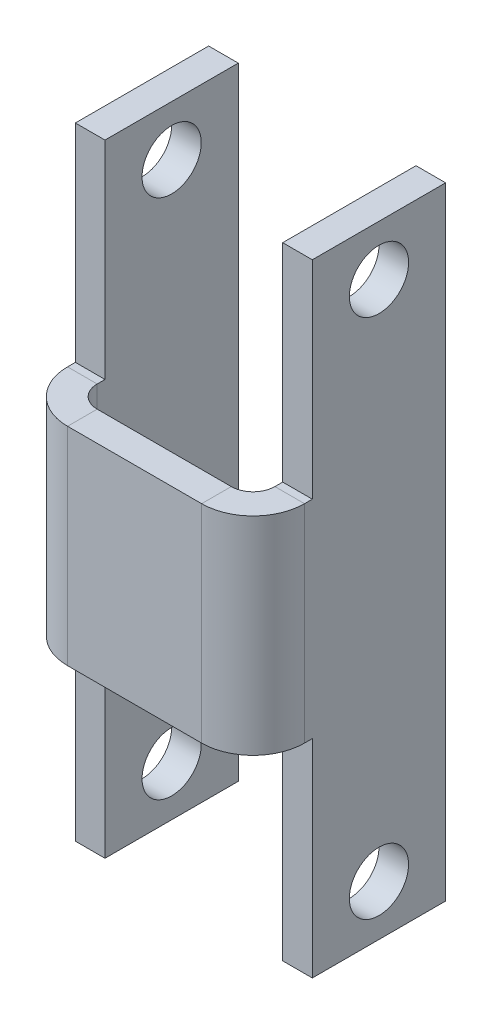
ISO-10303-21;
HEADER;
FILE_DESCRIPTION(('STEP AP214'),'2;1');
FILE_NAME('part.step','',(''),(''),'','','');
FILE_SCHEMA(('AUTOMOTIVE_DESIGN { 1 0 10303 214 1 1 1 1 }'));
ENDSEC;
DATA;
#1=APPLICATION_CONTEXT('core data for automotive mechanical design processes');
#2=APPLICATION_PROTOCOL_DEFINITION('international standard','automotive_design',2000,#1);
#3=PRODUCT_CONTEXT('',#1,'mechanical');
#4=PRODUCT('Part','Part','',(#3));
#5=PRODUCT_RELATED_PRODUCT_CATEGORY('part','',(#4));
#6=PRODUCT_DEFINITION_FORMATION('','',#4);
#7=PRODUCT_DEFINITION_CONTEXT('part definition',#1,'design');
#8=PRODUCT_DEFINITION('design','',#6,#7);
#9=PRODUCT_DEFINITION_SHAPE('','',#8);
#10=(LENGTH_UNIT() NAMED_UNIT(*) SI_UNIT(.MILLI.,.METRE.));
#11=(NAMED_UNIT(*) PLANE_ANGLE_UNIT() SI_UNIT($,.RADIAN.));
#12=(NAMED_UNIT(*) SI_UNIT($,.STERADIAN.) SOLID_ANGLE_UNIT());
#13=UNCERTAINTY_MEASURE_WITH_UNIT(LENGTH_MEASURE(1.E-05),#10,'distance_accuracy_value','');
#14=(GEOMETRIC_REPRESENTATION_CONTEXT(3) GLOBAL_UNCERTAINTY_ASSIGNED_CONTEXT((#13)) GLOBAL_UNIT_ASSIGNED_CONTEXT((#10,
#11,#12)) REPRESENTATION_CONTEXT('',''));
#15=CARTESIAN_POINT('',(0.,0.,0.));
#16=DIRECTION('',(0.,0.,1.));
#17=DIRECTION('',(1.,0.,0.));
#18=AXIS2_PLACEMENT_3D('',#15,#16,#17);
#19=CARTESIAN_POINT('',(-6.,-3.5,0.));
#20=DIRECTION('',(0.,1.,0.));
#21=DIRECTION('',(0.,0.,1.));
#22=AXIS2_PLACEMENT_3D('',#19,#20,#21);
#23=PLANE('',#22);
#24=DIRECTION('',(0.,0.,1.));
#25=VECTOR('',#24,1.);
#26=CARTESIAN_POINT('',(4.,-3.5,0.));
#27=LINE('',#26,#25);
#28=CARTESIAN_POINT('',(4.,-3.5,-2.));
#29=VERTEX_POINT('',#28);
#30=CARTESIAN_POINT('',(4.,-3.5,-1.73659999999999));
#31=VERTEX_POINT('',#30);
#32=EDGE_CURVE('E228',#29,#31,#27,.T.);
#33=ORIENTED_EDGE('',*,*,#32,.T.);
#34=DIRECTION('',(-1.,0.,0.));
#35=VECTOR('',#34,1.);
#36=CARTESIAN_POINT('',(4.,-3.5,-1.73659999999999));
#37=LINE('',#36,#35);
#38=CARTESIAN_POINT('',(3.,-3.5,-1.7366));
#39=VERTEX_POINT('',#38);
#40=EDGE_CURVE('E13',#31,#39,#37,.T.);
#41=ORIENTED_EDGE('',*,*,#40,.T.);
#42=DIRECTION('',(0.,0.,-1.));
#43=VECTOR('',#42,1.);
#44=CARTESIAN_POINT('',(3.,-3.5,0.));
#45=LINE('',#44,#43);
#46=CARTESIAN_POINT('',(3.,-3.5,-2.));
#47=VERTEX_POINT('',#46);
#48=EDGE_CURVE('E305',#39,#47,#45,.T.);
#49=ORIENTED_EDGE('',*,*,#48,.T.);
#50=DIRECTION('',(1.,0.,0.));
#51=VECTOR('',#50,1.);
#52=CARTESIAN_POINT('',(-6.,-3.5,-2.00000000000003));
#53=LINE('',#52,#51);
#54=EDGE_CURVE('E97',#47,#29,#53,.T.);
#55=ORIENTED_EDGE('',*,*,#54,.T.);
#56=EDGE_LOOP('',(#33,#41,#49,#55));
#57=FACE_BOUND('',#56,.T.);
#58=ADVANCED_FACE('F80',(#57),#23,.F.);
#59=DIRECTION('',(1.,0.,0.));
#60=VECTOR('',#59,1.);
#61=CARTESIAN_POINT('',(0.,-3.5,-1.));
#62=LINE('',#61,#60);
#63=CARTESIAN_POINT('',(-2.2634,-3.5,-1.));
#64=VERTEX_POINT('',#63);
#65=CARTESIAN_POINT('',(2.2634,-3.5,-1.));
#66=VERTEX_POINT('',#65);
#67=EDGE_CURVE('E350',#64,#66,#62,.T.);
#68=ORIENTED_EDGE('',*,*,#67,.T.);
#69=DIRECTION('',(0.,0.,1.));
#70=VECTOR('',#69,1.);
#71=CARTESIAN_POINT('',(2.2634,-3.5,-1.));
#72=LINE('',#71,#70);
#73=CARTESIAN_POINT('',(2.2634,-3.5,0.));
#74=VERTEX_POINT('',#73);
#75=EDGE_CURVE('E89',#66,#74,#72,.T.);
#76=ORIENTED_EDGE('',*,*,#75,.T.);
#77=DIRECTION('',(1.,0.,0.));
#78=VECTOR('',#77,1.);
#79=CARTESIAN_POINT('',(-6.,-3.5,0.));
#80=LINE('',#79,#78);
#81=CARTESIAN_POINT('',(-2.26340000000001,-3.5,0.));
#82=VERTEX_POINT('',#81);
#83=EDGE_CURVE('E337',#82,#74,#80,.T.);
#84=ORIENTED_EDGE('',*,*,#83,.F.);
#85=DIRECTION('',(0.,0.,-1.));
#86=VECTOR('',#85,1.);
#87=CARTESIAN_POINT('',(-2.26340000000001,-3.5,0.));
#88=LINE('',#87,#86);
#89=EDGE_CURVE('E315',#82,#64,#88,.T.);
#90=ORIENTED_EDGE('',*,*,#89,.T.);
#91=EDGE_LOOP('',(#68,#76,#84,#90));
#92=FACE_BOUND('',#91,.T.);
#93=ADVANCED_FACE('F488',(#92),#23,.F.);
#94=DIRECTION('',(0.,0.,1.));
#95=VECTOR('',#94,1.);
#96=CARTESIAN_POINT('',(-3.,-3.5,0.));
#97=LINE('',#96,#95);
#98=CARTESIAN_POINT('',(-3.,-3.5,-2.00000000000002));
#99=VERTEX_POINT('',#98);
#100=CARTESIAN_POINT('',(-3.,-3.5,-1.7366));
#101=VERTEX_POINT('',#100);
#102=EDGE_CURVE('E356',#99,#101,#97,.T.);
#103=ORIENTED_EDGE('',*,*,#102,.T.);
#104=DIRECTION('',(-1.,0.,0.));
#105=VECTOR('',#104,1.);
#106=CARTESIAN_POINT('',(-3.,-3.5,-1.7366));
#107=LINE('',#106,#105);
#108=CARTESIAN_POINT('',(-4.,-3.5,-1.73659999999999));
#109=VERTEX_POINT('',#108);
#110=EDGE_CURVE('E317',#101,#109,#107,.T.);
#111=ORIENTED_EDGE('',*,*,#110,.T.);
#112=DIRECTION('',(0.,0.,1.));
#113=VECTOR('',#112,1.);
#114=CARTESIAN_POINT('',(-4.,-3.5,0.));
#115=LINE('',#114,#113);
#116=CARTESIAN_POINT('',(-4.,-3.5,-2.00000000000002));
#117=VERTEX_POINT('',#116);
#118=EDGE_CURVE('E362',#117,#109,#115,.T.);
#119=ORIENTED_EDGE('',*,*,#118,.F.);
#120=EDGE_CURVE('E341',#117,#99,#53,.T.);
#121=ORIENTED_EDGE('',*,*,#120,.T.);
#122=EDGE_LOOP('',(#103,#111,#119,#121));
#123=FACE_BOUND('',#122,.T.);
#124=ADVANCED_FACE('F482',(#123),#23,.F.);
#125=ORIENTED_EDGE('',*,*,#40,.F.);
#126=CARTESIAN_POINT('',(2.2634,-3.5,-1.7366));
#127=DIRECTION('',(0.,1.,0.));
#128=DIRECTION('',(0.,0.,1.));
#129=AXIS2_PLACEMENT_3D('',#126,#127,#128);
#130=CIRCLE('',#129,1.7366);
#131=EDGE_CURVE('E359',#31,#74,#130,.F.);
#132=ORIENTED_EDGE('',*,*,#131,.T.);
#133=ORIENTED_EDGE('',*,*,#75,.F.);
#134=CARTESIAN_POINT('',(2.2634,-3.5,-1.7366));
#135=DIRECTION('',(0.,1.,0.));
#136=DIRECTION('',(0.,0.,1.));
#137=AXIS2_PLACEMENT_3D('',#134,#135,#136);
#138=CIRCLE('',#137,0.7366);
#139=EDGE_CURVE('E347',#39,#66,#138,.F.);
#140=ORIENTED_EDGE('',*,*,#139,.F.);
#141=EDGE_LOOP('',(#125,#132,#133,#140));
#142=FACE_BOUND('',#141,.T.);
#143=ADVANCED_FACE('F491',(#142),#23,.F.);
#144=CARTESIAN_POINT('',(-6.,3.5,0.));
#145=DIRECTION('',(0.,-1.,0.));
#146=DIRECTION('',(0.,0.,-1.));
#147=AXIS2_PLACEMENT_3D('',#144,#145,#146);
#148=PLANE('',#147);
#149=DIRECTION('',(0.,0.,1.));
#150=VECTOR('',#149,1.);
#151=CARTESIAN_POINT('',(3.,3.5,0.));
#152=LINE('',#151,#150);
#153=CARTESIAN_POINT('',(3.,3.5,-2.00000000000003));
#154=VERTEX_POINT('',#153);
#155=CARTESIAN_POINT('',(3.,3.5,-1.7366));
#156=VERTEX_POINT('',#155);
#157=EDGE_CURVE('E298',#154,#156,#152,.T.);
#158=ORIENTED_EDGE('',*,*,#157,.T.);
#159=DIRECTION('',(1.,0.,0.));
#160=VECTOR('',#159,1.);
#161=CARTESIAN_POINT('',(3.,3.5,-1.7366));
#162=LINE('',#161,#160);
#163=CARTESIAN_POINT('',(4.,3.5,-1.73659999999999));
#164=VERTEX_POINT('',#163);
#165=EDGE_CURVE('E313',#156,#164,#162,.T.);
#166=ORIENTED_EDGE('',*,*,#165,.T.);
#167=DIRECTION('',(0.,0.,-1.));
#168=VECTOR('',#167,1.);
#169=CARTESIAN_POINT('',(4.,3.5,0.));
#170=LINE('',#169,#168);
#171=CARTESIAN_POINT('',(4.,3.5,-2.));
#172=VERTEX_POINT('',#171);
#173=EDGE_CURVE('E368',#164,#172,#170,.T.);
#174=ORIENTED_EDGE('',*,*,#173,.T.);
#175=DIRECTION('',(1.,0.,0.));
#176=VECTOR('',#175,1.);
#177=CARTESIAN_POINT('',(-6.,3.5,-2.00000000000003));
#178=LINE('',#177,#176);
#179=EDGE_CURVE('E105',#154,#172,#178,.T.);
#180=ORIENTED_EDGE('',*,*,#179,.F.);
#181=EDGE_LOOP('',(#158,#166,#174,#180));
#182=FACE_BOUND('',#181,.T.);
#183=ADVANCED_FACE('F425',(#182),#148,.F.);
#184=DIRECTION('',(1.,0.,0.));
#185=VECTOR('',#184,1.);
#186=CARTESIAN_POINT('',(-6.,3.5,0.));
#187=LINE('',#186,#185);
#188=CARTESIAN_POINT('',(-2.26340000000001,3.5,0.));
#189=VERTEX_POINT('',#188);
#190=CARTESIAN_POINT('',(2.2634,3.5,0.));
#191=VERTEX_POINT('',#190);
#192=EDGE_CURVE('E372',#189,#191,#187,.T.);
#193=ORIENTED_EDGE('',*,*,#192,.T.);
#194=DIRECTION('',(0.,0.,-1.));
#195=VECTOR('',#194,1.);
#196=CARTESIAN_POINT('',(2.2634,3.5,0.));
#197=LINE('',#196,#195);
#198=CARTESIAN_POINT('',(2.2634,3.5,-1.));
#199=VERTEX_POINT('',#198);
#200=EDGE_CURVE('E311',#191,#199,#197,.T.);
#201=ORIENTED_EDGE('',*,*,#200,.T.);
#202=DIRECTION('',(-1.,0.,0.));
#203=VECTOR('',#202,1.);
#204=CARTESIAN_POINT('',(0.,3.5,-1.));
#205=LINE('',#204,#203);
#206=CARTESIAN_POINT('',(-2.2634,3.5,-1.));
#207=VERTEX_POINT('',#206);
#208=EDGE_CURVE('E384',#199,#207,#205,.T.);
#209=ORIENTED_EDGE('',*,*,#208,.T.);
#210=DIRECTION('',(0.,0.,1.));
#211=VECTOR('',#210,1.);
#212=CARTESIAN_POINT('',(-2.2634,3.5,-1.));
#213=LINE('',#212,#211);
#214=EDGE_CURVE('E309',#207,#189,#213,.T.);
#215=ORIENTED_EDGE('',*,*,#214,.T.);
#216=EDGE_LOOP('',(#193,#201,#209,#215));
#217=FACE_BOUND('',#216,.T.);
#218=ADVANCED_FACE('F438',(#217),#148,.F.);
#219=ORIENTED_EDGE('',*,*,#165,.F.);
#220=CARTESIAN_POINT('',(2.2634,3.5,-1.7366));
#221=DIRECTION('',(0.,-1.,0.));
#222=DIRECTION('',(0.,0.,-1.));
#223=AXIS2_PLACEMENT_3D('',#220,#221,#222);
#224=CIRCLE('',#223,0.7366);
#225=EDGE_CURVE('E381',#199,#156,#224,.F.);
#226=ORIENTED_EDGE('',*,*,#225,.F.);
#227=ORIENTED_EDGE('',*,*,#200,.F.);
#228=CARTESIAN_POINT('',(2.2634,3.5,-1.7366));
#229=DIRECTION('',(0.,-1.,0.));
#230=DIRECTION('',(0.,0.,-1.));
#231=AXIS2_PLACEMENT_3D('',#228,#229,#230);
#232=CIRCLE('',#231,1.7366);
#233=EDGE_CURVE('E392',#191,#164,#232,.F.);
#234=ORIENTED_EDGE('',*,*,#233,.T.);
#235=EDGE_LOOP('',(#219,#226,#227,#234));
#236=FACE_BOUND('',#235,.T.);
#237=ADVANCED_FACE('F432',(#236),#148,.F.);
#238=DIRECTION('',(0.,0.,-1.));
#239=VECTOR('',#238,1.);
#240=CARTESIAN_POINT('',(-4.,3.5,0.));
#241=LINE('',#240,#239);
#242=CARTESIAN_POINT('',(-4.,3.5,-1.73659999999999));
#243=VERTEX_POINT('',#242);
#244=CARTESIAN_POINT('',(-4.,3.5,-2.00000000000002));
#245=VERTEX_POINT('',#244);
#246=EDGE_CURVE('E395',#243,#245,#241,.T.);
#247=ORIENTED_EDGE('',*,*,#246,.F.);
#248=DIRECTION('',(1.,0.,0.));
#249=VECTOR('',#248,1.);
#250=CARTESIAN_POINT('',(-4.,3.5,-1.73659999999999));
#251=LINE('',#250,#249);
#252=CARTESIAN_POINT('',(-3.,3.5,-1.7366));
#253=VERTEX_POINT('',#252);
#254=EDGE_CURVE('E307',#243,#253,#251,.T.);
#255=ORIENTED_EDGE('',*,*,#254,.T.);
#256=DIRECTION('',(0.,0.,-1.));
#257=VECTOR('',#256,1.);
#258=CARTESIAN_POINT('',(-3.,3.5,0.));
#259=LINE('',#258,#257);
#260=CARTESIAN_POINT('',(-3.,3.5,-2.00000000000002));
#261=VERTEX_POINT('',#260);
#262=EDGE_CURVE('E390',#253,#261,#259,.T.);
#263=ORIENTED_EDGE('',*,*,#262,.T.);
#264=EDGE_CURVE('E377',#245,#261,#178,.T.);
#265=ORIENTED_EDGE('',*,*,#264,.F.);
#266=EDGE_LOOP('',(#247,#255,#263,#265));
#267=FACE_BOUND('',#266,.T.);
#268=ADVANCED_FACE('F455',(#267),#148,.F.);
#269=CARTESIAN_POINT('',(0.,0.,-1.));
#270=DIRECTION('',(0.,0.,-1.));
#271=DIRECTION('',(-1.,0.,0.));
#272=AXIS2_PLACEMENT_3D('',#269,#270,#271);
#273=PLANE('',#272);
#274=ORIENTED_EDGE('',*,*,#67,.F.);
#275=DIRECTION('',(0.,1.,0.));
#276=VECTOR('',#275,1.);
#277=CARTESIAN_POINT('',(-2.2634,10.5,-1.));
#278=LINE('',#277,#276);
#279=EDGE_CURVE('E272',#207,#64,#278,.F.);
#280=ORIENTED_EDGE('',*,*,#279,.F.);
#281=ORIENTED_EDGE('',*,*,#208,.F.);
#282=DIRECTION('',(0.,-1.,0.));
#283=VECTOR('',#282,1.);
#284=CARTESIAN_POINT('',(2.2634,-10.5,-1.));
#285=LINE('',#284,#283);
#286=EDGE_CURVE('E266',#66,#199,#285,.F.);
#287=ORIENTED_EDGE('',*,*,#286,.F.);
#288=EDGE_LOOP('',(#274,#280,#281,#287));
#289=FACE_BOUND('',#288,.T.);
#290=ADVANCED_FACE('F436',(#289),#273,.T.);
#291=CARTESIAN_POINT('',(0.,0.,0.));
#292=DIRECTION('',(0.,0.,-1.));
#293=DIRECTION('',(-1.,0.,0.));
#294=AXIS2_PLACEMENT_3D('',#291,#292,#293);
#295=PLANE('',#294);
#296=DIRECTION('',(0.,1.,0.));
#297=VECTOR('',#296,1.);
#298=CARTESIAN_POINT('',(-2.2634,10.5,0.));
#299=LINE('',#298,#297);
#300=EDGE_CURVE('E295',#189,#82,#299,.F.);
#301=ORIENTED_EDGE('',*,*,#300,.T.);
#302=ORIENTED_EDGE('',*,*,#83,.T.);
#303=DIRECTION('',(0.,-1.,0.));
#304=VECTOR('',#303,1.);
#305=CARTESIAN_POINT('',(2.2634,-10.5,0.));
#306=LINE('',#305,#304);
#307=EDGE_CURVE('E262',#74,#191,#306,.F.);
#308=ORIENTED_EDGE('',*,*,#307,.T.);
#309=ORIENTED_EDGE('',*,*,#192,.F.);
#310=EDGE_LOOP('',(#301,#302,#308,#309));
#311=FACE_BOUND('',#310,.T.);
#312=ADVANCED_FACE('F82',(#311),#295,.F.);
#313=CARTESIAN_POINT('',(-2.2634,10.5,-1.7366));
#314=DIRECTION('',(0.,1.,0.));
#315=DIRECTION('',(-1.,0.,0.));
#316=AXIS2_PLACEMENT_3D('',#313,#314,#315);
#317=CYLINDRICAL_SURFACE('',#316,1.7366);
#318=CARTESIAN_POINT('',(-2.2634,-3.5,-1.7366));
#319=DIRECTION('',(0.,1.,0.));
#320=DIRECTION('',(0.,0.,1.));
#321=AXIS2_PLACEMENT_3D('',#318,#319,#320);
#322=CIRCLE('',#321,1.7366);
#323=EDGE_CURVE('E365',#82,#109,#322,.F.);
#324=ORIENTED_EDGE('',*,*,#323,.F.);
#325=ORIENTED_EDGE('',*,*,#300,.F.);
#326=CARTESIAN_POINT('',(-2.2634,3.5,-1.7366));
#327=DIRECTION('',(0.,-1.,0.));
#328=DIRECTION('',(0.,0.,-1.));
#329=AXIS2_PLACEMENT_3D('',#326,#327,#328);
#330=CIRCLE('',#329,1.7366);
#331=EDGE_CURVE('E398',#243,#189,#330,.F.);
#332=ORIENTED_EDGE('',*,*,#331,.F.);
#333=DIRECTION('',(0.,1.,0.));
#334=VECTOR('',#333,1.);
#335=CARTESIAN_POINT('',(-4.,-10.5,-1.73659999999999));
#336=LINE('',#335,#334);
#337=EDGE_CURVE('E290',#243,#109,#336,.F.);
#338=ORIENTED_EDGE('',*,*,#337,.T.);
#339=EDGE_LOOP('',(#324,#325,#332,#338));
#340=FACE_BOUND('',#339,.T.);
#341=ADVANCED_FACE('F503',(#340),#317,.T.);
#342=CARTESIAN_POINT('',(-2.2634,10.5,-1.7366));
#343=DIRECTION('',(0.,1.,0.));
#344=DIRECTION('',(-1.,0.,0.));
#345=AXIS2_PLACEMENT_3D('',#342,#343,#344);
#346=CYLINDRICAL_SURFACE('',#345,0.7366);
#347=ORIENTED_EDGE('',*,*,#279,.T.);
#348=CARTESIAN_POINT('',(-2.2634,-3.5,-1.7366));
#349=DIRECTION('',(0.,1.,0.));
#350=DIRECTION('',(0.,0.,1.));
#351=AXIS2_PLACEMENT_3D('',#348,#349,#350);
#352=CIRCLE('',#351,0.7366);
#353=EDGE_CURVE('E353',#64,#101,#352,.F.);
#354=ORIENTED_EDGE('',*,*,#353,.T.);
#355=DIRECTION('',(0.,1.,0.));
#356=VECTOR('',#355,1.);
#357=CARTESIAN_POINT('',(-3.,-10.5,-1.7366));
#358=LINE('',#357,#356);
#359=EDGE_CURVE('E265',#101,#253,#358,.T.);
#360=ORIENTED_EDGE('',*,*,#359,.T.);
#361=CARTESIAN_POINT('',(-2.2634,3.5,-1.7366));
#362=DIRECTION('',(0.,-1.,0.));
#363=DIRECTION('',(0.,0.,-1.));
#364=AXIS2_PLACEMENT_3D('',#361,#362,#363);
#365=CIRCLE('',#364,0.7366);
#366=EDGE_CURVE('E387',#253,#207,#365,.F.);
#367=ORIENTED_EDGE('',*,*,#366,.T.);
#368=EDGE_LOOP('',(#347,#354,#360,#367));
#369=FACE_BOUND('',#368,.T.);
#370=ADVANCED_FACE('F441',(#369),#346,.F.);
#371=CARTESIAN_POINT('',(-4.00000000000002,10.5,-6.5));
#372=DIRECTION('',(0.,-1.,0.));
#373=DIRECTION('',(0.,0.,-1.));
#374=AXIS2_PLACEMENT_3D('',#371,#372,#373);
#375=PLANE('',#374);
#376=DIRECTION('',(0.,0.,-1.));
#377=VECTOR('',#376,1.);
#378=CARTESIAN_POINT('',(-4.,10.5,0.));
#379=LINE('',#378,#377);
#380=CARTESIAN_POINT('',(-4.,10.5,-2.00000000000002));
#381=VERTEX_POINT('',#380);
#382=CARTESIAN_POINT('',(-4.00000000000002,10.5,-6.5));
#383=VERTEX_POINT('',#382);
#384=EDGE_CURVE('E281',#381,#383,#379,.T.);
#385=ORIENTED_EDGE('',*,*,#384,.F.);
#386=DIRECTION('',(1.,0.,0.));
#387=VECTOR('',#386,1.);
#388=CARTESIAN_POINT('',(-6.,10.5,-2.00000000000003));
#389=LINE('',#388,#387);
#390=CARTESIAN_POINT('',(-3.,10.5,-2.00000000000002));
#391=VERTEX_POINT('',#390);
#392=EDGE_CURVE('E376',#381,#391,#389,.T.);
#393=ORIENTED_EDGE('',*,*,#392,.T.);
#394=DIRECTION('',(0.,0.,1.));
#395=VECTOR('',#394,1.);
#396=CARTESIAN_POINT('',(-3.00000000000002,10.5,-6.5));
#397=LINE('',#396,#395);
#398=CARTESIAN_POINT('',(-3.00000000000002,10.5,-6.5));
#399=VERTEX_POINT('',#398);
#400=EDGE_CURVE('E288',#391,#399,#397,.F.);
#401=ORIENTED_EDGE('',*,*,#400,.T.);
#402=DIRECTION('',(1.,0.,0.));
#403=VECTOR('',#402,1.);
#404=CARTESIAN_POINT('',(-4.00000000000002,10.5,-6.5));
#405=LINE('',#404,#403);
#406=EDGE_CURVE('E269',#383,#399,#405,.T.);
#407=ORIENTED_EDGE('',*,*,#406,.F.);
#408=EDGE_LOOP('',(#385,#393,#401,#407));
#409=FACE_BOUND('',#408,.T.);
#410=ADVANCED_FACE('F466',(#409),#375,.F.);
#411=CARTESIAN_POINT('',(-4.,-10.5,-0.999999999999997));
#412=DIRECTION('',(0.,1.,0.));
#413=DIRECTION('',(0.,0.,1.));
#414=AXIS2_PLACEMENT_3D('',#411,#412,#413);
#415=PLANE('',#414);
#416=DIRECTION('',(0.,0.,-1.));
#417=VECTOR('',#416,1.);
#418=CARTESIAN_POINT('',(-3.,-10.5,-1.));
#419=LINE('',#418,#417);
#420=CARTESIAN_POINT('',(-3.00000000000002,-10.5,-6.5));
#421=VERTEX_POINT('',#420);
#422=CARTESIAN_POINT('',(-3.,-10.5,-2.00000000000002));
#423=VERTEX_POINT('',#422);
#424=EDGE_CURVE('E283',#421,#423,#419,.F.);
#425=ORIENTED_EDGE('',*,*,#424,.T.);
#426=DIRECTION('',(1.,0.,0.));
#427=VECTOR('',#426,1.);
#428=CARTESIAN_POINT('',(-6.,-10.5,-2.00000000000003));
#429=LINE('',#428,#427);
#430=CARTESIAN_POINT('',(-4.,-10.5,-2.00000000000002));
#431=VERTEX_POINT('',#430);
#432=EDGE_CURVE('E227',#431,#423,#429,.T.);
#433=ORIENTED_EDGE('',*,*,#432,.F.);
#434=DIRECTION('',(0.,0.,1.));
#435=VECTOR('',#434,1.);
#436=CARTESIAN_POINT('',(-4.,-10.5,0.));
#437=LINE('',#436,#435);
#438=CARTESIAN_POINT('',(-4.00000000000002,-10.5,-6.5));
#439=VERTEX_POINT('',#438);
#440=EDGE_CURVE('E276',#439,#431,#437,.T.);
#441=ORIENTED_EDGE('',*,*,#440,.F.);
#442=DIRECTION('',(1.,0.,0.));
#443=VECTOR('',#442,1.);
#444=CARTESIAN_POINT('',(-4.00000000000002,-10.5,-6.5));
#445=LINE('',#444,#443);
#446=EDGE_CURVE('E273',#439,#421,#445,.T.);
#447=ORIENTED_EDGE('',*,*,#446,.T.);
#448=EDGE_LOOP('',(#425,#433,#441,#447));
#449=FACE_BOUND('',#448,.T.);
#450=ADVANCED_FACE('F474',(#449),#415,.F.);
#451=CARTESIAN_POINT('',(-4.,0.,0.));
#452=DIRECTION('',(1.,0.,0.));
#453=DIRECTION('',(0.,0.,-1.));
#454=AXIS2_PLACEMENT_3D('',#451,#452,#453);
#455=PLANE('',#454);
#456=CARTESIAN_POINT('',(-4.00000000000001,-8.8,-4.25000000000003));
#457=DIRECTION('',(1.,0.,0.));
#458=DIRECTION('',(0.,0.,-1.));
#459=AXIS2_PLACEMENT_3D('',#456,#457,#458);
#460=CIRCLE('',#459,1.);
#461=CARTESIAN_POINT('',(-4.00000000000002,-8.8,-5.25000000000003));
#462=VERTEX_POINT('',#461);
#463=EDGE_CURVE('E847',#462,#462,#460,.F.);
#464=ORIENTED_EDGE('',*,*,#463,.F.);
#465=EDGE_LOOP('',(#464));
#466=FACE_BOUND('',#465,.T.);
#467=CARTESIAN_POINT('',(-4.00000000000001,8.8,-4.25000000000002));
#468=DIRECTION('',(1.,0.,0.));
#469=DIRECTION('',(0.,0.,-1.));
#470=AXIS2_PLACEMENT_3D('',#467,#468,#469);
#471=CIRCLE('',#470,1.);
#472=CARTESIAN_POINT('',(-4.00000000000002,8.8,-5.25000000000002));
#473=VERTEX_POINT('',#472);
#474=EDGE_CURVE('E321',#473,#473,#471,.F.);
#475=ORIENTED_EDGE('',*,*,#474,.F.);
#476=EDGE_LOOP('',(#475));
#477=FACE_BOUND('',#476,.T.);
#478=DIRECTION('',(0.,1.,0.));
#479=VECTOR('',#478,1.);
#480=CARTESIAN_POINT('',(-4.,0.,-2.00000000000002));
#481=LINE('',#480,#479);
#482=EDGE_CURVE('E344',#431,#117,#481,.T.);
#483=ORIENTED_EDGE('',*,*,#482,.T.);
#484=ORIENTED_EDGE('',*,*,#118,.T.);
#485=ORIENTED_EDGE('',*,*,#337,.F.);
#486=ORIENTED_EDGE('',*,*,#246,.T.);
#487=DIRECTION('',(0.,1.,0.));
#488=VECTOR('',#487,1.);
#489=CARTESIAN_POINT('',(-4.,0.,-2.00000000000002));
#490=LINE('',#489,#488);
#491=EDGE_CURVE('E261',#245,#381,#490,.T.);
#492=ORIENTED_EDGE('',*,*,#491,.T.);
#493=ORIENTED_EDGE('',*,*,#384,.T.);
#494=DIRECTION('',(0.,-1.,0.));
#495=VECTOR('',#494,1.);
#496=CARTESIAN_POINT('',(-4.00000000000002,0.,-6.5));
#497=LINE('',#496,#495);
#498=EDGE_CURVE('E279',#383,#439,#497,.T.);
#499=ORIENTED_EDGE('',*,*,#498,.T.);
#500=ORIENTED_EDGE('',*,*,#440,.T.);
#501=EDGE_LOOP('',(#483,#484,#485,#486,#492,#493,#499,#500));
#502=FACE_BOUND('',#501,.T.);
#503=ADVANCED_FACE('F461',(#466,#477,#502),#455,.F.);
#504=CARTESIAN_POINT('',(-3.,0.,0.));
#505=DIRECTION('',(1.,0.,0.));
#506=DIRECTION('',(0.,0.,-1.));
#507=AXIS2_PLACEMENT_3D('',#504,#505,#506);
#508=PLANE('',#507);
#509=CARTESIAN_POINT('',(-3.00000000000001,-8.8,-4.25000000000002));
#510=DIRECTION('',(1.,0.,0.));
#511=DIRECTION('',(0.,0.,-1.));
#512=AXIS2_PLACEMENT_3D('',#509,#510,#511);
#513=CIRCLE('',#512,1.);
#514=CARTESIAN_POINT('',(-3.00000000000001,-8.8,-5.25000000000002));
#515=VERTEX_POINT('',#514);
#516=EDGE_CURVE('E332',#515,#515,#513,.T.);
#517=ORIENTED_EDGE('',*,*,#516,.F.);
#518=EDGE_LOOP('',(#517));
#519=FACE_BOUND('',#518,.T.);
#520=CARTESIAN_POINT('',(-3.00000000000001,8.8,-4.25000000000002));
#521=DIRECTION('',(1.,0.,0.));
#522=DIRECTION('',(0.,0.,-1.));
#523=AXIS2_PLACEMENT_3D('',#520,#521,#522);
#524=CIRCLE('',#523,1.);
#525=CARTESIAN_POINT('',(-3.00000000000001,8.8,-5.25000000000002));
#526=VERTEX_POINT('',#525);
#527=EDGE_CURVE('E236',#526,#526,#524,.T.);
#528=ORIENTED_EDGE('',*,*,#527,.F.);
#529=EDGE_LOOP('',(#528));
#530=FACE_BOUND('',#529,.T.);
#531=ORIENTED_EDGE('',*,*,#102,.F.);
#532=DIRECTION('',(0.,1.,0.));
#533=VECTOR('',#532,1.);
#534=CARTESIAN_POINT('',(-3.,0.,-2.00000000000002));
#535=LINE('',#534,#533);
#536=EDGE_CURVE('E340',#423,#99,#535,.T.);
#537=ORIENTED_EDGE('',*,*,#536,.F.);
#538=ORIENTED_EDGE('',*,*,#424,.F.);
#539=DIRECTION('',(0.,1.,0.));
#540=VECTOR('',#539,1.);
#541=CARTESIAN_POINT('',(-3.00000000000002,-10.5,-6.5));
#542=LINE('',#541,#540);
#543=EDGE_CURVE('E286',#399,#421,#542,.F.);
#544=ORIENTED_EDGE('',*,*,#543,.F.);
#545=ORIENTED_EDGE('',*,*,#400,.F.);
#546=DIRECTION('',(0.,1.,0.));
#547=VECTOR('',#546,1.);
#548=CARTESIAN_POINT('',(-3.,0.,-2.00000000000002));
#549=LINE('',#548,#547);
#550=EDGE_CURVE('E401',#261,#391,#549,.T.);
#551=ORIENTED_EDGE('',*,*,#550,.F.);
#552=ORIENTED_EDGE('',*,*,#262,.F.);
#553=ORIENTED_EDGE('',*,*,#359,.F.);
#554=EDGE_LOOP('',(#531,#537,#538,#544,#545,#551,#552,#553));
#555=FACE_BOUND('',#554,.T.);
#556=ADVANCED_FACE('F450',(#519,#530,#555),#508,.T.);
#557=CARTESIAN_POINT('',(-4.00000000000002,-10.5,-6.5));
#558=DIRECTION('',(0.,0.,1.));
#559=DIRECTION('',(1.,0.,0.));
#560=AXIS2_PLACEMENT_3D('',#557,#558,#559);
#561=PLANE('',#560);
#562=ORIENTED_EDGE('',*,*,#543,.T.);
#563=ORIENTED_EDGE('',*,*,#446,.F.);
#564=ORIENTED_EDGE('',*,*,#498,.F.);
#565=ORIENTED_EDGE('',*,*,#406,.T.);
#566=EDGE_LOOP('',(#562,#563,#564,#565));
#567=FACE_BOUND('',#566,.T.);
#568=ADVANCED_FACE('F469',(#567),#561,.F.);
#569=CARTESIAN_POINT('',(2.2634,-10.5,-1.7366));
#570=DIRECTION('',(0.,-1.,0.));
#571=DIRECTION('',(1.,0.,0.));
#572=AXIS2_PLACEMENT_3D('',#569,#570,#571);
#573=CYLINDRICAL_SURFACE('',#572,1.7366);
#574=ORIENTED_EDGE('',*,*,#131,.F.);
#575=DIRECTION('',(0.,-1.,0.));
#576=VECTOR('',#575,1.);
#577=CARTESIAN_POINT('',(4.,10.5,-1.73659999999999));
#578=LINE('',#577,#576);
#579=EDGE_CURVE('E255',#31,#164,#578,.F.);
#580=ORIENTED_EDGE('',*,*,#579,.T.);
#581=ORIENTED_EDGE('',*,*,#233,.F.);
#582=ORIENTED_EDGE('',*,*,#307,.F.);
#583=EDGE_LOOP('',(#574,#580,#581,#582));
#584=FACE_BOUND('',#583,.T.);
#585=ADVANCED_FACE('F496',(#584),#573,.T.);
#586=CARTESIAN_POINT('',(2.2634,-10.5,-1.7366));
#587=DIRECTION('',(0.,-1.,0.));
#588=DIRECTION('',(1.,0.,0.));
#589=AXIS2_PLACEMENT_3D('',#586,#587,#588);
#590=CYLINDRICAL_SURFACE('',#589,0.7366);
#591=DIRECTION('',(0.,-1.,0.));
#592=VECTOR('',#591,1.);
#593=CARTESIAN_POINT('',(3.,10.5,-1.7366));
#594=LINE('',#593,#592);
#595=EDGE_CURVE('E258',#156,#39,#594,.T.);
#596=ORIENTED_EDGE('',*,*,#595,.T.);
#597=ORIENTED_EDGE('',*,*,#139,.T.);
#598=ORIENTED_EDGE('',*,*,#286,.T.);
#599=ORIENTED_EDGE('',*,*,#225,.T.);
#600=EDGE_LOOP('',(#596,#597,#598,#599));
#601=FACE_BOUND('',#600,.T.);
#602=ADVANCED_FACE('F428',(#601),#590,.F.);
#603=CARTESIAN_POINT('',(4.00000000000002,-10.5,-6.5));
#604=DIRECTION('',(0.,1.,0.));
#605=DIRECTION('',(0.,0.,1.));
#606=AXIS2_PLACEMENT_3D('',#603,#604,#605);
#607=PLANE('',#606);
#608=DIRECTION('',(0.,0.,-1.));
#609=VECTOR('',#608,1.);
#610=CARTESIAN_POINT('',(4.,-10.5,0.));
#611=LINE('',#610,#609);
#612=CARTESIAN_POINT('',(4.,-10.5,-1.99999999999999));
#613=VERTEX_POINT('',#612);
#614=CARTESIAN_POINT('',(4.00000000000002,-10.5,-6.5));
#615=VERTEX_POINT('',#614);
#616=EDGE_CURVE('E233',#613,#615,#611,.T.);
#617=ORIENTED_EDGE('',*,*,#616,.F.);
#618=CARTESIAN_POINT('',(3.,-10.5,-2.));
#619=VERTEX_POINT('',#618);
#620=EDGE_CURVE('E217',#619,#613,#429,.T.);
#621=ORIENTED_EDGE('',*,*,#620,.F.);
#622=DIRECTION('',(0.,0.,1.));
#623=VECTOR('',#622,1.);
#624=CARTESIAN_POINT('',(3.00000000000002,-10.5,-6.5));
#625=LINE('',#624,#623);
#626=CARTESIAN_POINT('',(3.00000000000002,-10.5,-6.5));
#627=VERTEX_POINT('',#626);
#628=EDGE_CURVE('E253',#619,#627,#625,.F.);
#629=ORIENTED_EDGE('',*,*,#628,.T.);
#630=DIRECTION('',(-1.,0.,0.));
#631=VECTOR('',#630,1.);
#632=CARTESIAN_POINT('',(4.00000000000002,-10.5,-6.5));
#633=LINE('',#632,#631);
#634=EDGE_CURVE('E241',#615,#627,#633,.T.);
#635=ORIENTED_EDGE('',*,*,#634,.F.);
#636=EDGE_LOOP('',(#617,#621,#629,#635));
#637=FACE_BOUND('',#636,.T.);
#638=ADVANCED_FACE('F239',(#637),#607,.F.);
#639=CARTESIAN_POINT('',(4.,10.5,-0.999999999999997));
#640=DIRECTION('',(0.,-1.,0.));
#641=DIRECTION('',(0.,0.,-1.));
#642=AXIS2_PLACEMENT_3D('',#639,#640,#641);
#643=PLANE('',#642);
#644=DIRECTION('',(0.,0.,-1.));
#645=VECTOR('',#644,1.);
#646=CARTESIAN_POINT('',(3.,10.5,-1.));
#647=LINE('',#646,#645);
#648=CARTESIAN_POINT('',(3.00000000000002,10.5,-6.5));
#649=VERTEX_POINT('',#648);
#650=CARTESIAN_POINT('',(3.,10.5,-2.));
#651=VERTEX_POINT('',#650);
#652=EDGE_CURVE('E243',#649,#651,#647,.F.);
#653=ORIENTED_EDGE('',*,*,#652,.T.);
#654=CARTESIAN_POINT('',(4.,10.5,-1.99999999999999));
#655=VERTEX_POINT('',#654);
#656=EDGE_CURVE('E373',#651,#655,#389,.T.);
#657=ORIENTED_EDGE('',*,*,#656,.T.);
#658=DIRECTION('',(0.,0.,1.));
#659=VECTOR('',#658,1.);
#660=CARTESIAN_POINT('',(4.,10.5,0.));
#661=LINE('',#660,#659);
#662=CARTESIAN_POINT('',(4.00000000000002,10.5,-6.5));
#663=VERTEX_POINT('',#662);
#664=EDGE_CURVE('E245',#663,#655,#661,.T.);
#665=ORIENTED_EDGE('',*,*,#664,.F.);
#666=DIRECTION('',(-1.,0.,0.));
#667=VECTOR('',#666,1.);
#668=CARTESIAN_POINT('',(4.00000000000002,10.5,-6.5));
#669=LINE('',#668,#667);
#670=EDGE_CURVE('E406',#663,#649,#669,.T.);
#671=ORIENTED_EDGE('',*,*,#670,.T.);
#672=EDGE_LOOP('',(#653,#657,#665,#671));
#673=FACE_BOUND('',#672,.T.);
#674=ADVANCED_FACE('F414',(#673),#643,.F.);
#675=CARTESIAN_POINT('',(4.,0.,0.));
#676=DIRECTION('',(-1.,0.,0.));
#677=DIRECTION('',(0.,0.,1.));
#678=AXIS2_PLACEMENT_3D('',#675,#676,#677);
#679=PLANE('',#678);
#680=CARTESIAN_POINT('',(4.00000000000001,-8.8,-4.25));
#681=DIRECTION('',(1.,0.,0.));
#682=DIRECTION('',(0.,0.,1.));
#683=AXIS2_PLACEMENT_3D('',#680,#681,#682);
#684=CIRCLE('',#683,1.);
#685=CARTESIAN_POINT('',(4.00000000000001,-8.8,-3.25));
#686=VERTEX_POINT('',#685);
#687=EDGE_CURVE('E849',#686,#686,#684,.T.);
#688=ORIENTED_EDGE('',*,*,#687,.F.);
#689=EDGE_LOOP('',(#688));
#690=FACE_BOUND('',#689,.T.);
#691=CARTESIAN_POINT('',(4.00000000000001,8.8,-4.25));
#692=DIRECTION('',(1.,0.,0.));
#693=DIRECTION('',(0.,0.,-1.));
#694=AXIS2_PLACEMENT_3D('',#691,#692,#693);
#695=CIRCLE('',#694,1.);
#696=CARTESIAN_POINT('',(4.00000000000002,8.8,-5.25));
#697=VERTEX_POINT('',#696);
#698=EDGE_CURVE('E327',#697,#697,#695,.T.);
#699=ORIENTED_EDGE('',*,*,#698,.F.);
#700=EDGE_LOOP('',(#699));
#701=FACE_BOUND('',#700,.T.);
#702=ORIENTED_EDGE('',*,*,#579,.F.);
#703=ORIENTED_EDGE('',*,*,#32,.F.);
#704=DIRECTION('',(0.,1.,0.));
#705=VECTOR('',#704,1.);
#706=CARTESIAN_POINT('',(4.,-10.5,-1.99999999999999));
#707=LINE('',#706,#705);
#708=EDGE_CURVE('E220',#613,#29,#707,.T.);
#709=ORIENTED_EDGE('',*,*,#708,.F.);
#710=ORIENTED_EDGE('',*,*,#616,.T.);
#711=DIRECTION('',(0.,1.,0.));
#712=VECTOR('',#711,1.);
#713=CARTESIAN_POINT('',(4.00000000000002,0.,-6.5));
#714=LINE('',#713,#712);
#715=EDGE_CURVE('E242',#615,#663,#714,.T.);
#716=ORIENTED_EDGE('',*,*,#715,.T.);
#717=ORIENTED_EDGE('',*,*,#664,.T.);
#718=DIRECTION('',(0.,1.,0.));
#719=VECTOR('',#718,1.);
#720=CARTESIAN_POINT('',(4.,10.5,-1.99999999999999));
#721=LINE('',#720,#719);
#722=EDGE_CURVE('E370',#172,#655,#721,.T.);
#723=ORIENTED_EDGE('',*,*,#722,.F.);
#724=ORIENTED_EDGE('',*,*,#173,.F.);
#725=EDGE_LOOP('',(#702,#703,#709,#710,#716,#717,#723,#724));
#726=FACE_BOUND('',#725,.T.);
#727=ADVANCED_FACE('F232',(#690,#701,#726),#679,.F.);
#728=CARTESIAN_POINT('',(3.,0.,0.));
#729=DIRECTION('',(-1.,0.,0.));
#730=DIRECTION('',(0.,0.,1.));
#731=AXIS2_PLACEMENT_3D('',#728,#729,#730);
#732=PLANE('',#731);
#733=CARTESIAN_POINT('',(3.00000000000001,-8.8,-4.25));
#734=DIRECTION('',(-1.,0.,0.));
#735=DIRECTION('',(0.,0.,1.));
#736=AXIS2_PLACEMENT_3D('',#733,#734,#735);
#737=CIRCLE('',#736,1.);
#738=CARTESIAN_POINT('',(3.00000000000001,-8.8,-3.25));
#739=VERTEX_POINT('',#738);
#740=EDGE_CURVE('E84',#739,#739,#737,.T.);
#741=ORIENTED_EDGE('',*,*,#740,.F.);
#742=EDGE_LOOP('',(#741));
#743=FACE_BOUND('',#742,.T.);
#744=CARTESIAN_POINT('',(3.00000000000001,8.8,-4.25));
#745=DIRECTION('',(-1.,0.,0.));
#746=DIRECTION('',(0.,0.,1.));
#747=AXIS2_PLACEMENT_3D('',#744,#745,#746);
#748=CIRCLE('',#747,1.);
#749=CARTESIAN_POINT('',(3.00000000000001,8.8,-3.25));
#750=VERTEX_POINT('',#749);
#751=EDGE_CURVE('E319',#750,#750,#748,.T.);
#752=ORIENTED_EDGE('',*,*,#751,.F.);
#753=EDGE_LOOP('',(#752));
#754=FACE_BOUND('',#753,.T.);
#755=ORIENTED_EDGE('',*,*,#48,.F.);
#756=ORIENTED_EDGE('',*,*,#595,.F.);
#757=ORIENTED_EDGE('',*,*,#157,.F.);
#758=DIRECTION('',(0.,-1.,0.));
#759=VECTOR('',#758,1.);
#760=CARTESIAN_POINT('',(3.,0.,-2.));
#761=LINE('',#760,#759);
#762=EDGE_CURVE('E302',#651,#154,#761,.T.);
#763=ORIENTED_EDGE('',*,*,#762,.F.);
#764=ORIENTED_EDGE('',*,*,#652,.F.);
#765=DIRECTION('',(0.,-1.,0.));
#766=VECTOR('',#765,1.);
#767=CARTESIAN_POINT('',(3.00000000000002,10.5,-6.5));
#768=LINE('',#767,#766);
#769=EDGE_CURVE('E248',#627,#649,#768,.F.);
#770=ORIENTED_EDGE('',*,*,#769,.F.);
#771=ORIENTED_EDGE('',*,*,#628,.F.);
#772=DIRECTION('',(0.,-1.,0.));
#773=VECTOR('',#772,1.);
#774=CARTESIAN_POINT('',(3.,0.,-2.));
#775=LINE('',#774,#773);
#776=EDGE_CURVE('E223',#47,#619,#775,.T.);
#777=ORIENTED_EDGE('',*,*,#776,.F.);
#778=EDGE_LOOP('',(#755,#756,#757,#763,#764,#770,#771,#777));
#779=FACE_BOUND('',#778,.T.);
#780=ADVANCED_FACE('F422',(#743,#754,#779),#732,.T.);
#781=CARTESIAN_POINT('',(4.00000000000002,10.5,-6.5));
#782=DIRECTION('',(0.,0.,1.));
#783=DIRECTION('',(1.,0.,0.));
#784=AXIS2_PLACEMENT_3D('',#781,#782,#783);
#785=PLANE('',#784);
#786=ORIENTED_EDGE('',*,*,#769,.T.);
#787=ORIENTED_EDGE('',*,*,#670,.F.);
#788=ORIENTED_EDGE('',*,*,#715,.F.);
#789=ORIENTED_EDGE('',*,*,#634,.T.);
#790=EDGE_LOOP('',(#786,#787,#788,#789));
#791=FACE_BOUND('',#790,.T.);
#792=ADVANCED_FACE('F550',(#791),#785,.F.);
#793=CARTESIAN_POINT('',(-6.,10.5,-2.00000000000003));
#794=DIRECTION('',(0.,0.,-1.));
#795=DIRECTION('',(-1.,0.,0.));
#796=AXIS2_PLACEMENT_3D('',#793,#794,#795);
#797=PLANE('',#796);
#798=ORIENTED_EDGE('',*,*,#264,.T.);
#799=ORIENTED_EDGE('',*,*,#550,.T.);
#800=ORIENTED_EDGE('',*,*,#392,.F.);
#801=ORIENTED_EDGE('',*,*,#491,.F.);
#802=EDGE_LOOP('',(#798,#799,#800,#801));
#803=FACE_BOUND('',#802,.T.);
#804=ADVANCED_FACE('F457',(#803),#797,.F.);
#805=ORIENTED_EDGE('',*,*,#762,.T.);
#806=ORIENTED_EDGE('',*,*,#179,.T.);
#807=ORIENTED_EDGE('',*,*,#722,.T.);
#808=ORIENTED_EDGE('',*,*,#656,.F.);
#809=EDGE_LOOP('',(#805,#806,#807,#808));
#810=FACE_BOUND('',#809,.T.);
#811=ADVANCED_FACE('F418',(#810),#797,.F.);
#812=ORIENTED_EDGE('',*,*,#214,.F.);
#813=ORIENTED_EDGE('',*,*,#366,.F.);
#814=ORIENTED_EDGE('',*,*,#254,.F.);
#815=ORIENTED_EDGE('',*,*,#331,.T.);
#816=EDGE_LOOP('',(#812,#813,#814,#815));
#817=FACE_BOUND('',#816,.T.);
#818=ADVANCED_FACE('F445',(#817),#148,.F.);
#819=CARTESIAN_POINT('',(-6.,-10.5,-2.00000000000003));
#820=DIRECTION('',(0.,0.,-1.));
#821=DIRECTION('',(-1.,0.,0.));
#822=AXIS2_PLACEMENT_3D('',#819,#820,#821);
#823=PLANE('',#822);
#824=ORIENTED_EDGE('',*,*,#432,.T.);
#825=ORIENTED_EDGE('',*,*,#536,.T.);
#826=ORIENTED_EDGE('',*,*,#120,.F.);
#827=ORIENTED_EDGE('',*,*,#482,.F.);
#828=EDGE_LOOP('',(#824,#825,#826,#827));
#829=FACE_BOUND('',#828,.T.);
#830=ADVANCED_FACE('F478',(#829),#823,.F.);
#831=ORIENTED_EDGE('',*,*,#110,.F.);
#832=ORIENTED_EDGE('',*,*,#353,.F.);
#833=ORIENTED_EDGE('',*,*,#89,.F.);
#834=ORIENTED_EDGE('',*,*,#323,.T.);
#835=EDGE_LOOP('',(#831,#832,#833,#834));
#836=FACE_BOUND('',#835,.T.);
#837=ADVANCED_FACE('F485',(#836),#23,.F.);
#838=ORIENTED_EDGE('',*,*,#776,.T.);
#839=ORIENTED_EDGE('',*,*,#620,.T.);
#840=ORIENTED_EDGE('',*,*,#708,.T.);
#841=ORIENTED_EDGE('',*,*,#54,.F.);
#842=EDGE_LOOP('',(#838,#839,#840,#841));
#843=FACE_BOUND('',#842,.T.);
#844=ADVANCED_FACE('F219',(#843),#823,.F.);
#845=CARTESIAN_POINT('',(-6.8284271247462,8.8,-4.25000000000003));
#846=DIRECTION('',(1.,0.,0.));
#847=DIRECTION('',(0.,0.,-1.));
#848=AXIS2_PLACEMENT_3D('',#845,#846,#847);
#849=CYLINDRICAL_SURFACE('',#848,1.);
#850=ORIENTED_EDGE('',*,*,#751,.T.);
#851=EDGE_LOOP('',(#850));
#852=FACE_BOUND('',#851,.T.);
#853=ORIENTED_EDGE('',*,*,#698,.T.);
#854=EDGE_LOOP('',(#853));
#855=FACE_BOUND('',#854,.T.);
#856=ADVANCED_FACE('F525',(#852,#855),#849,.F.);
#857=ORIENTED_EDGE('',*,*,#527,.T.);
#858=EDGE_LOOP('',(#857));
#859=FACE_BOUND('',#858,.T.);
#860=ORIENTED_EDGE('',*,*,#474,.T.);
#861=EDGE_LOOP('',(#860));
#862=FACE_BOUND('',#861,.T.);
#863=ADVANCED_FACE('F622',(#859,#862),#849,.F.);
#864=CARTESIAN_POINT('',(-6.8284271247462,-8.8,-4.25000000000004));
#865=DIRECTION('',(1.,0.,0.));
#866=DIRECTION('',(0.,0.,-1.));
#867=AXIS2_PLACEMENT_3D('',#864,#865,#866);
#868=CYLINDRICAL_SURFACE('',#867,1.);
#869=ORIENTED_EDGE('',*,*,#740,.T.);
#870=EDGE_LOOP('',(#869));
#871=FACE_BOUND('',#870,.T.);
#872=ORIENTED_EDGE('',*,*,#687,.T.);
#873=EDGE_LOOP('',(#872));
#874=FACE_BOUND('',#873,.T.);
#875=ADVANCED_FACE('F632',(#871,#874),#868,.F.);
#876=ORIENTED_EDGE('',*,*,#516,.T.);
#877=EDGE_LOOP('',(#876));
#878=FACE_BOUND('',#877,.T.);
#879=ORIENTED_EDGE('',*,*,#463,.T.);
#880=EDGE_LOOP('',(#879));
#881=FACE_BOUND('',#880,.T.);
#882=ADVANCED_FACE('F642',(#878,#881),#868,.F.);
#883=CLOSED_SHELL('',(#58,#93,#124,#143,#183,#218,#237,#268,#290,#312,#341,#370,#410,#450,#503,
#556,#568,#585,#602,#638,#674,#727,#780,#792,#804,#811,#818,#830,#837,#844,#856,#863,#875,#882));
#884=MANIFOLD_SOLID_BREP('B2',#883);
#885=ADVANCED_BREP_SHAPE_REPRESENTATION('',(#18,#884),#14);
#886=SHAPE_DEFINITION_REPRESENTATION(#9,#885);
ENDSEC;
END-ISO-10303-21;
